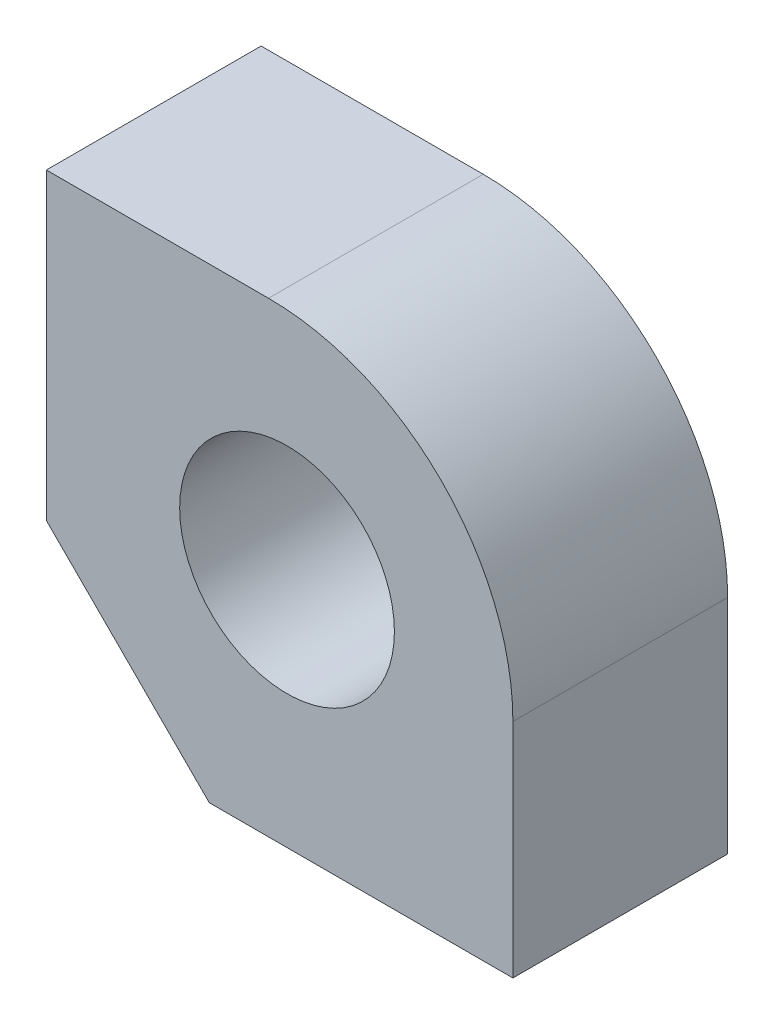
ISO-10303-21;
HEADER;
FILE_DESCRIPTION(('STEP AP214'),'2;1');
FILE_NAME('part.step','',(''),(''),'','','');
FILE_SCHEMA(('AUTOMOTIVE_DESIGN { 1 0 10303 214 1 1 1 1 }'));
ENDSEC;
DATA;
#1=APPLICATION_CONTEXT('core data for automotive mechanical design processes');
#2=APPLICATION_PROTOCOL_DEFINITION('international standard','automotive_design',2000,#1);
#3=PRODUCT_CONTEXT('',#1,'mechanical');
#4=PRODUCT('Part','Part','',(#3));
#5=PRODUCT_RELATED_PRODUCT_CATEGORY('part','',(#4));
#6=PRODUCT_DEFINITION_FORMATION('','',#4);
#7=PRODUCT_DEFINITION_CONTEXT('part definition',#1,'design');
#8=PRODUCT_DEFINITION('design','',#6,#7);
#9=PRODUCT_DEFINITION_SHAPE('','',#8);
#10=(LENGTH_UNIT() NAMED_UNIT(*) SI_UNIT(.MILLI.,.METRE.));
#11=(NAMED_UNIT(*) PLANE_ANGLE_UNIT() SI_UNIT($,.RADIAN.));
#12=(NAMED_UNIT(*) SI_UNIT($,.STERADIAN.) SOLID_ANGLE_UNIT());
#13=UNCERTAINTY_MEASURE_WITH_UNIT(LENGTH_MEASURE(1.E-05),#10,'distance_accuracy_value','');
#14=(GEOMETRIC_REPRESENTATION_CONTEXT(3) GLOBAL_UNCERTAINTY_ASSIGNED_CONTEXT((#13)) GLOBAL_UNIT_ASSIGNED_CONTEXT((#10,
#11,#12)) REPRESENTATION_CONTEXT('',''));
#15=CARTESIAN_POINT('',(0.,0.,0.));
#16=DIRECTION('',(0.,0.,1.));
#17=DIRECTION('',(1.,0.,0.));
#18=AXIS2_PLACEMENT_3D('',#15,#16,#17);
#19=CARTESIAN_POINT('',(-11.5,-43.5,0.));
#20=DIRECTION('',(0.,0.,1.));
#21=DIRECTION('',(1.,0.,0.));
#22=AXIS2_PLACEMENT_3D('',#19,#20,#21);
#23=PLANE('',#22);
#24=CARTESIAN_POINT('',(-11.25,-43.25,0.));
#25=DIRECTION('',(0.,0.,-1.));
#26=DIRECTION('',(-1.,0.,0.));
#27=AXIS2_PLACEMENT_3D('',#24,#25,#26);
#28=CIRCLE('',#27,1.44999999999999);
#29=CARTESIAN_POINT('',(-12.7,-43.25,0.));
#30=VERTEX_POINT('',#29);
#31=EDGE_CURVE('E20',#30,#30,#28,.F.);
#32=ORIENTED_EDGE('',*,*,#31,.T.);
#33=EDGE_LOOP('',(#32));
#34=FACE_BOUND('',#33,.T.);
#35=DIRECTION('',(0.,1.,0.));
#36=VECTOR('',#35,1.);
#37=CARTESIAN_POINT('',(-14.5,-40.2,0.));
#38=LINE('',#37,#36);
#39=CARTESIAN_POINT('',(-14.5,-44.3,0.));
#40=VERTEX_POINT('',#39);
#41=CARTESIAN_POINT('',(-14.5,-40.2,0.));
#42=VERTEX_POINT('',#41);
#43=EDGE_CURVE('E75',#40,#42,#38,.T.);
#44=ORIENTED_EDGE('',*,*,#43,.T.);
#45=DIRECTION('',(1.,0.,0.));
#46=VECTOR('',#45,1.);
#47=CARTESIAN_POINT('',(-11.5,-40.2,0.));
#48=LINE('',#47,#46);
#49=CARTESIAN_POINT('',(-11.5,-40.2,0.));
#50=VERTEX_POINT('',#49);
#51=EDGE_CURVE('E70',#42,#50,#48,.T.);
#52=ORIENTED_EDGE('',*,*,#51,.T.);
#53=CARTESIAN_POINT('',(-11.5,-43.5,0.));
#54=DIRECTION('',(0.,0.,-1.));
#55=DIRECTION('',(-1.,0.,0.));
#56=AXIS2_PLACEMENT_3D('',#53,#54,#55);
#57=CIRCLE('',#56,3.3);
#58=CARTESIAN_POINT('',(-8.19999999999999,-43.5,0.));
#59=VERTEX_POINT('',#58);
#60=EDGE_CURVE('E72',#59,#50,#57,.F.);
#61=ORIENTED_EDGE('',*,*,#60,.F.);
#62=DIRECTION('',(0.,-1.,0.));
#63=VECTOR('',#62,1.);
#64=CARTESIAN_POINT('',(-8.19999999999999,-46.5,0.));
#65=LINE('',#64,#63);
#66=CARTESIAN_POINT('',(-8.19999999999999,-46.5,0.));
#67=VERTEX_POINT('',#66);
#68=EDGE_CURVE('E65',#59,#67,#65,.T.);
#69=ORIENTED_EDGE('',*,*,#68,.T.);
#70=DIRECTION('',(1.,0.,0.));
#71=VECTOR('',#70,1.);
#72=CARTESIAN_POINT('',(-12.3,-46.5,0.));
#73=LINE('',#72,#71);
#74=CARTESIAN_POINT('',(-12.3,-46.5,0.));
#75=VERTEX_POINT('',#74);
#76=EDGE_CURVE('E118',#67,#75,#73,.F.);
#77=ORIENTED_EDGE('',*,*,#76,.T.);
#78=DIRECTION('',(-0.707106781186543,0.707106781186552,0.));
#79=VECTOR('',#78,1.);
#80=CARTESIAN_POINT('',(-14.5,-44.3,0.));
#81=LINE('',#80,#79);
#82=EDGE_CURVE('E128',#75,#40,#81,.T.);
#83=ORIENTED_EDGE('',*,*,#82,.T.);
#84=EDGE_LOOP('',(#44,#52,#61,#69,#77,#83));
#85=FACE_BOUND('',#84,.T.);
#86=ADVANCED_FACE('F17',(#34,#85),#23,.F.);
#87=CARTESIAN_POINT('',(-11.25,-43.25,11.8095454429505));
#88=DIRECTION('',(0.,0.,-1.));
#89=DIRECTION('',(-1.,0.,0.));
#90=AXIS2_PLACEMENT_3D('',#87,#88,#89);
#91=CYLINDRICAL_SURFACE('',#90,1.44999999999999);
#92=CARTESIAN_POINT('',(-11.25,-43.25,2.9));
#93=DIRECTION('',(0.,0.,-1.));
#94=DIRECTION('',(-1.,0.,0.));
#95=AXIS2_PLACEMENT_3D('',#92,#93,#94);
#96=CIRCLE('',#95,1.44999999999999);
#97=CARTESIAN_POINT('',(-12.7,-43.25,2.9));
#98=VERTEX_POINT('',#97);
#99=EDGE_CURVE('E112',#98,#98,#96,.F.);
#100=ORIENTED_EDGE('',*,*,#99,.T.);
#101=EDGE_LOOP('',(#100));
#102=FACE_BOUND('',#101,.T.);
#103=ORIENTED_EDGE('',*,*,#31,.F.);
#104=EDGE_LOOP('',(#103));
#105=FACE_BOUND('',#104,.T.);
#106=ADVANCED_FACE('F172',(#102,#105),#91,.F.);
#107=CARTESIAN_POINT('',(-14.5,-44.3,11.8095454429505));
#108=DIRECTION('',(0.707106781186552,0.707106781186543,0.));
#109=DIRECTION('',(-0.707106781186543,0.707106781186552,0.));
#110=AXIS2_PLACEMENT_3D('',#107,#108,#109);
#111=PLANE('',#110);
#112=DIRECTION('',(-0.707106781186543,0.707106781186552,0.));
#113=VECTOR('',#112,1.);
#114=CARTESIAN_POINT('',(-12.3,-46.5,2.9));
#115=LINE('',#114,#113);
#116=CARTESIAN_POINT('',(-12.3,-46.5,2.9));
#117=VERTEX_POINT('',#116);
#118=CARTESIAN_POINT('',(-14.5,-44.3,2.9));
#119=VERTEX_POINT('',#118);
#120=EDGE_CURVE('E103',#117,#119,#115,.T.);
#121=ORIENTED_EDGE('',*,*,#120,.T.);
#122=DIRECTION('',(0.,0.,1.));
#123=VECTOR('',#122,1.);
#124=CARTESIAN_POINT('',(-14.5,-44.3,11.8095454429505));
#125=LINE('',#124,#123);
#126=EDGE_CURVE('E80',#119,#40,#125,.F.);
#127=ORIENTED_EDGE('',*,*,#126,.T.);
#128=ORIENTED_EDGE('',*,*,#82,.F.);
#129=DIRECTION('',(0.,0.,1.));
#130=VECTOR('',#129,1.);
#131=CARTESIAN_POINT('',(-12.3,-46.5,11.8095454429505));
#132=LINE('',#131,#130);
#133=EDGE_CURVE('E115',#75,#117,#132,.T.);
#134=ORIENTED_EDGE('',*,*,#133,.T.);
#135=EDGE_LOOP('',(#121,#127,#128,#134));
#136=FACE_BOUND('',#135,.T.);
#137=ADVANCED_FACE('F161',(#136),#111,.F.);
#138=CARTESIAN_POINT('',(-14.5,-40.2,11.8095454429505));
#139=DIRECTION('',(1.,0.,0.));
#140=DIRECTION('',(0.,1.,0.));
#141=AXIS2_PLACEMENT_3D('',#138,#139,#140);
#142=PLANE('',#141);
#143=DIRECTION('',(0.,1.,0.));
#144=VECTOR('',#143,1.);
#145=CARTESIAN_POINT('',(-14.5,0.,2.9));
#146=LINE('',#145,#144);
#147=CARTESIAN_POINT('',(-14.5,-40.2,2.9));
#148=VERTEX_POINT('',#147);
#149=EDGE_CURVE('E100',#119,#148,#146,.T.);
#150=ORIENTED_EDGE('',*,*,#149,.T.);
#151=DIRECTION('',(0.,0.,-1.));
#152=VECTOR('',#151,1.);
#153=CARTESIAN_POINT('',(-14.5,-40.2,11.8095454429505));
#154=LINE('',#153,#152);
#155=EDGE_CURVE('E79',#148,#42,#154,.T.);
#156=ORIENTED_EDGE('',*,*,#155,.T.);
#157=ORIENTED_EDGE('',*,*,#43,.F.);
#158=ORIENTED_EDGE('',*,*,#126,.F.);
#159=EDGE_LOOP('',(#150,#156,#157,#158));
#160=FACE_BOUND('',#159,.T.);
#161=ADVANCED_FACE('F163',(#160),#142,.F.);
#162=CARTESIAN_POINT('',(-11.5,-40.2,11.8095454429505));
#163=DIRECTION('',(0.,-1.,0.));
#164=DIRECTION('',(0.,0.,-1.));
#165=AXIS2_PLACEMENT_3D('',#162,#163,#164);
#166=PLANE('',#165);
#167=DIRECTION('',(-1.,0.,0.));
#168=VECTOR('',#167,1.);
#169=CARTESIAN_POINT('',(0.,-40.2,2.9));
#170=LINE('',#169,#168);
#171=CARTESIAN_POINT('',(-11.5,-40.2,2.9));
#172=VERTEX_POINT('',#171);
#173=EDGE_CURVE('E91',#148,#172,#170,.F.);
#174=ORIENTED_EDGE('',*,*,#173,.T.);
#175=DIRECTION('',(0.,0.,-1.));
#176=VECTOR('',#175,1.);
#177=CARTESIAN_POINT('',(-11.5,-40.2,11.8095454429505));
#178=LINE('',#177,#176);
#179=EDGE_CURVE('E85',#50,#172,#178,.F.);
#180=ORIENTED_EDGE('',*,*,#179,.F.);
#181=ORIENTED_EDGE('',*,*,#51,.F.);
#182=ORIENTED_EDGE('',*,*,#155,.F.);
#183=EDGE_LOOP('',(#174,#180,#181,#182));
#184=FACE_BOUND('',#183,.T.);
#185=ADVANCED_FACE('F89',(#184),#166,.F.);
#186=CARTESIAN_POINT('',(-11.5,-43.5,11.8095454429505));
#187=DIRECTION('',(0.,0.,-1.));
#188=DIRECTION('',(-1.,0.,0.));
#189=AXIS2_PLACEMENT_3D('',#186,#187,#188);
#190=CYLINDRICAL_SURFACE('',#189,3.3);
#191=DIRECTION('',(0.,0.,1.));
#192=VECTOR('',#191,1.);
#193=CARTESIAN_POINT('',(-8.19999999999999,-43.5,11.8095454429505));
#194=LINE('',#193,#192);
#195=CARTESIAN_POINT('',(-8.19999999999999,-43.5,2.9));
#196=VERTEX_POINT('',#195);
#197=EDGE_CURVE('E87',#196,#59,#194,.F.);
#198=ORIENTED_EDGE('',*,*,#197,.T.);
#199=ORIENTED_EDGE('',*,*,#60,.T.);
#200=ORIENTED_EDGE('',*,*,#179,.T.);
#201=CARTESIAN_POINT('',(-11.5,-43.5,2.9));
#202=DIRECTION('',(0.,0.,-1.));
#203=DIRECTION('',(-1.,0.,0.));
#204=AXIS2_PLACEMENT_3D('',#201,#202,#203);
#205=CIRCLE('',#204,3.3);
#206=EDGE_CURVE('E137',#172,#196,#205,.T.);
#207=ORIENTED_EDGE('',*,*,#206,.T.);
#208=EDGE_LOOP('',(#198,#199,#200,#207));
#209=FACE_BOUND('',#208,.T.);
#210=ADVANCED_FACE('F83',(#209),#190,.T.);
#211=CARTESIAN_POINT('',(-8.19999999999999,-46.5,11.8095454429505));
#212=DIRECTION('',(-1.,0.,0.));
#213=DIRECTION('',(0.,-1.,0.));
#214=AXIS2_PLACEMENT_3D('',#211,#212,#213);
#215=PLANE('',#214);
#216=DIRECTION('',(0.,1.,0.));
#217=VECTOR('',#216,1.);
#218=CARTESIAN_POINT('',(-8.19999999999998,0.,2.9));
#219=LINE('',#218,#217);
#220=CARTESIAN_POINT('',(-8.19999999999999,-46.5,2.9));
#221=VERTEX_POINT('',#220);
#222=EDGE_CURVE('E26',#196,#221,#219,.F.);
#223=ORIENTED_EDGE('',*,*,#222,.T.);
#224=DIRECTION('',(0.,0.,1.));
#225=VECTOR('',#224,1.);
#226=CARTESIAN_POINT('',(-8.19999999999999,-46.5,11.8095454429505));
#227=LINE('',#226,#225);
#228=EDGE_CURVE('E34',#221,#67,#227,.F.);
#229=ORIENTED_EDGE('',*,*,#228,.T.);
#230=ORIENTED_EDGE('',*,*,#68,.F.);
#231=ORIENTED_EDGE('',*,*,#197,.F.);
#232=EDGE_LOOP('',(#223,#229,#230,#231));
#233=FACE_BOUND('',#232,.T.);
#234=ADVANCED_FACE('F153',(#233),#215,.F.);
#235=CARTESIAN_POINT('',(-12.3,-46.5,11.8095454429505));
#236=DIRECTION('',(0.,1.,0.));
#237=DIRECTION('',(0.,0.,1.));
#238=AXIS2_PLACEMENT_3D('',#235,#236,#237);
#239=PLANE('',#238);
#240=DIRECTION('',(-1.,0.,0.));
#241=VECTOR('',#240,1.);
#242=CARTESIAN_POINT('',(0.,-46.5,2.9));
#243=LINE('',#242,#241);
#244=EDGE_CURVE('E11',#221,#117,#243,.T.);
#245=ORIENTED_EDGE('',*,*,#244,.T.);
#246=ORIENTED_EDGE('',*,*,#133,.F.);
#247=ORIENTED_EDGE('',*,*,#76,.F.);
#248=ORIENTED_EDGE('',*,*,#228,.F.);
#249=EDGE_LOOP('',(#245,#246,#247,#248));
#250=FACE_BOUND('',#249,.T.);
#251=ADVANCED_FACE('F159',(#250),#239,.F.);
#252=CARTESIAN_POINT('',(0.,0.,2.9));
#253=DIRECTION('',(0.,0.,-1.));
#254=DIRECTION('',(-1.,0.,0.));
#255=AXIS2_PLACEMENT_3D('',#252,#253,#254);
#256=PLANE('',#255);
#257=ORIENTED_EDGE('',*,*,#222,.F.);
#258=ORIENTED_EDGE('',*,*,#206,.F.);
#259=ORIENTED_EDGE('',*,*,#173,.F.);
#260=ORIENTED_EDGE('',*,*,#149,.F.);
#261=ORIENTED_EDGE('',*,*,#120,.F.);
#262=ORIENTED_EDGE('',*,*,#244,.F.);
#263=EDGE_LOOP('',(#257,#258,#259,#260,#261,#262));
#264=FACE_BOUND('',#263,.T.);
#265=ORIENTED_EDGE('',*,*,#99,.F.);
#266=EDGE_LOOP('',(#265));
#267=FACE_BOUND('',#266,.T.);
#268=ADVANCED_FACE('F155',(#264,#267),#256,.F.);
#269=CLOSED_SHELL('',(#86,#106,#137,#161,#185,#210,#234,#251,#268));
#270=MANIFOLD_SOLID_BREP('B1',#269);
#271=ADVANCED_BREP_SHAPE_REPRESENTATION('',(#18,#270),#14);
#272=SHAPE_DEFINITION_REPRESENTATION(#9,#271);
ENDSEC;
END-ISO-10303-21;
